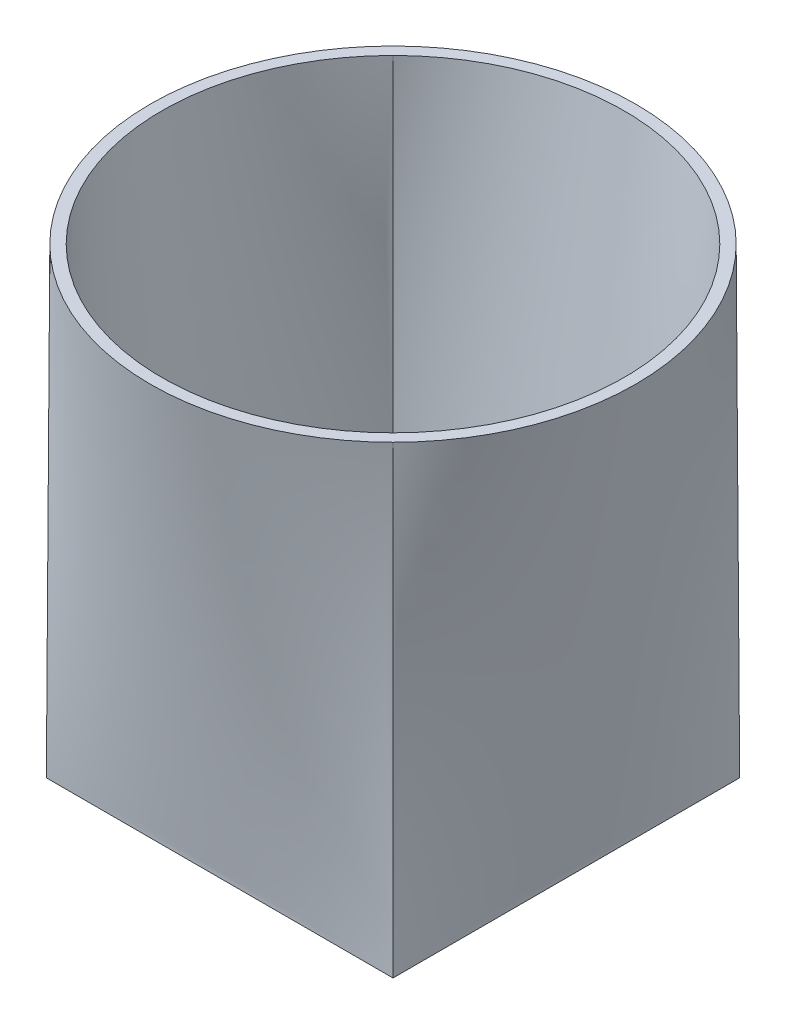
ISO-10303-21;
HEADER;
FILE_DESCRIPTION(('STEP AP214'),'2;1');
FILE_NAME('part.step','',(''),(''),'','','');
FILE_SCHEMA(('AUTOMOTIVE_DESIGN { 1 0 10303 214 1 1 1 1 }'));
ENDSEC;
DATA;
#1=APPLICATION_CONTEXT('core data for automotive mechanical design processes');
#2=APPLICATION_PROTOCOL_DEFINITION('international standard','automotive_design',2000,#1);
#3=PRODUCT_CONTEXT('',#1,'mechanical');
#4=PRODUCT('Part','Part','',(#3));
#5=PRODUCT_RELATED_PRODUCT_CATEGORY('part','',(#4));
#6=PRODUCT_DEFINITION_FORMATION('','',#4);
#7=PRODUCT_DEFINITION_CONTEXT('part definition',#1,'design');
#8=PRODUCT_DEFINITION('design','',#6,#7);
#9=PRODUCT_DEFINITION_SHAPE('','',#8);
#10=(LENGTH_UNIT() NAMED_UNIT(*) SI_UNIT(.MILLI.,.METRE.));
#11=(NAMED_UNIT(*) PLANE_ANGLE_UNIT() SI_UNIT($,.RADIAN.));
#12=(NAMED_UNIT(*) SI_UNIT($,.STERADIAN.) SOLID_ANGLE_UNIT());
#13=UNCERTAINTY_MEASURE_WITH_UNIT(LENGTH_MEASURE(1.E-05),#10,'distance_accuracy_value','');
#14=(GEOMETRIC_REPRESENTATION_CONTEXT(3) GLOBAL_UNCERTAINTY_ASSIGNED_CONTEXT((#13)) GLOBAL_UNIT_ASSIGNED_CONTEXT((#10,
#11,#12)) REPRESENTATION_CONTEXT('',''));
#15=CARTESIAN_POINT('',(0.,0.,0.));
#16=DIRECTION('',(0.,0.,1.));
#17=DIRECTION('',(1.,0.,0.));
#18=AXIS2_PLACEMENT_3D('',#15,#16,#17);
#19=CARTESIAN_POINT('',(0.,0.,0.));
#20=DIRECTION('',(0.,1.,0.));
#21=DIRECTION('',(0.,0.,1.));
#22=AXIS2_PLACEMENT_3D('',#19,#20,#21);
#23=PLANE('',#22);
#24=DIRECTION('',(0.,0.,-1.));
#25=VECTOR('',#24,1.);
#26=CARTESIAN_POINT('',(-72.5,0.,72.5));
#27=LINE('',#26,#25);
#28=CARTESIAN_POINT('',(-72.5,0.,72.5));
#29=VERTEX_POINT('',#28);
#30=CARTESIAN_POINT('',(-72.5,0.,-72.5));
#31=VERTEX_POINT('',#30);
#32=EDGE_CURVE('E106',#29,#31,#27,.T.);
#33=ORIENTED_EDGE('',*,*,#32,.F.);
#34=DIRECTION('',(-1.,0.,0.));
#35=VECTOR('',#34,1.);
#36=CARTESIAN_POINT('',(-72.5,0.,72.5));
#37=LINE('',#36,#35);
#38=CARTESIAN_POINT('',(72.5,0.,72.5));
#39=VERTEX_POINT('',#38);
#40=EDGE_CURVE('E195',#39,#29,#37,.T.);
#41=ORIENTED_EDGE('',*,*,#40,.F.);
#42=DIRECTION('',(0.,0.,1.));
#43=VECTOR('',#42,1.);
#44=CARTESIAN_POINT('',(72.5,0.,72.5));
#45=LINE('',#44,#43);
#46=CARTESIAN_POINT('',(72.5,0.,-72.5));
#47=VERTEX_POINT('',#46);
#48=EDGE_CURVE('E176',#47,#39,#45,.T.);
#49=ORIENTED_EDGE('',*,*,#48,.F.);
#50=DIRECTION('',(1.,0.,0.));
#51=VECTOR('',#50,1.);
#52=CARTESIAN_POINT('',(-72.5,0.,-72.5));
#53=LINE('',#52,#51);
#54=EDGE_CURVE('E168',#31,#47,#53,.T.);
#55=ORIENTED_EDGE('',*,*,#54,.F.);
#56=EDGE_LOOP('',(#33,#41,#49,#55));
#57=FACE_BOUND('',#56,.T.);
#58=DIRECTION('',(0.,0.,-1.));
#59=VECTOR('',#58,1.);
#60=CARTESIAN_POINT('',(75.,0.,-75.));
#61=LINE('',#60,#59);
#62=CARTESIAN_POINT('',(75.,0.,75.));
#63=VERTEX_POINT('',#62);
#64=CARTESIAN_POINT('',(75.,0.,-75.));
#65=VERTEX_POINT('',#64);
#66=EDGE_CURVE('E449',#63,#65,#61,.T.);
#67=ORIENTED_EDGE('',*,*,#66,.F.);
#68=DIRECTION('',(1.,0.,0.));
#69=VECTOR('',#68,1.);
#70=CARTESIAN_POINT('',(-75.,0.,75.));
#71=LINE('',#70,#69);
#72=CARTESIAN_POINT('',(-75.,0.,75.));
#73=VERTEX_POINT('',#72);
#74=EDGE_CURVE('E453',#73,#63,#71,.T.);
#75=ORIENTED_EDGE('',*,*,#74,.F.);
#76=DIRECTION('',(0.,0.,1.));
#77=VECTOR('',#76,1.);
#78=CARTESIAN_POINT('',(-75.,0.,-75.));
#79=LINE('',#78,#77);
#80=CARTESIAN_POINT('',(-75.,0.,-75.));
#81=VERTEX_POINT('',#80);
#82=EDGE_CURVE('E113',#81,#73,#79,.T.);
#83=ORIENTED_EDGE('',*,*,#82,.F.);
#84=DIRECTION('',(-1.,0.,0.));
#85=VECTOR('',#84,1.);
#86=CARTESIAN_POINT('',(-75.,0.,-75.));
#87=LINE('',#86,#85);
#88=EDGE_CURVE('E12',#65,#81,#87,.T.);
#89=ORIENTED_EDGE('',*,*,#88,.F.);
#90=EDGE_LOOP('',(#67,#75,#83,#89));
#91=FACE_BOUND('',#90,.T.);
#92=ADVANCED_FACE('F102',(#57,#91),#23,.F.);
#93=CARTESIAN_POINT('',(0.,200.,0.));
#94=DIRECTION('',(0.,1.,0.));
#95=DIRECTION('',(0.,0.,1.));
#96=AXIS2_PLACEMENT_3D('',#93,#94,#95);
#97=PLANE('',#96);
#98=CARTESIAN_POINT('',(0.,200.,0.));
#99=DIRECTION('',(0.,1.,0.));
#100=DIRECTION('',(0.,0.,1.));
#101=AXIS2_PLACEMENT_3D('',#98,#99,#100);
#102=CIRCLE('',#101,100.);
#103=CARTESIAN_POINT('',(-70.7106781186548,200.,70.7106781186547));
#104=VERTEX_POINT('',#103);
#105=CARTESIAN_POINT('',(70.7106781186547,200.,70.7106781186548));
#106=VERTEX_POINT('',#105);
#107=EDGE_CURVE('E238',#104,#106,#102,.T.);
#108=ORIENTED_EDGE('',*,*,#107,.F.);
#109=CARTESIAN_POINT('',(-70.7106781186547,200.,-70.7106781186548));
#110=VERTEX_POINT('',#109);
#111=EDGE_CURVE('E224',#110,#104,#102,.T.);
#112=ORIENTED_EDGE('',*,*,#111,.F.);
#113=CARTESIAN_POINT('',(70.7106781186548,200.,-70.7106781186548));
#114=VERTEX_POINT('',#113);
#115=EDGE_CURVE('E215',#114,#110,#102,.T.);
#116=ORIENTED_EDGE('',*,*,#115,.F.);
#117=EDGE_CURVE('E187',#106,#114,#102,.T.);
#118=ORIENTED_EDGE('',*,*,#117,.F.);
#119=EDGE_LOOP('',(#108,#112,#116,#118));
#120=FACE_BOUND('',#119,.T.);
#121=CARTESIAN_POINT('',(0.,200.,0.));
#122=DIRECTION('',(0.,1.,0.));
#123=DIRECTION('',(0.,0.,1.));
#124=AXIS2_PLACEMENT_3D('',#121,#122,#123);
#125=CIRCLE('',#124,105.);
#126=CARTESIAN_POINT('',(-74.2462120245875,200.,74.2462120245875));
#127=VERTEX_POINT('',#126);
#128=CARTESIAN_POINT('',(74.2462120245875,200.,74.2462120245874));
#129=VERTEX_POINT('',#128);
#130=EDGE_CURVE('E258',#127,#129,#125,.T.);
#131=ORIENTED_EDGE('',*,*,#130,.T.);
#132=CARTESIAN_POINT('',(74.2462120245875,200.,-74.2462120245875));
#133=VERTEX_POINT('',#132);
#134=EDGE_CURVE('E262',#129,#133,#125,.T.);
#135=ORIENTED_EDGE('',*,*,#134,.T.);
#136=CARTESIAN_POINT('',(-74.2462120245875,200.,-74.2462120245875));
#137=VERTEX_POINT('',#136);
#138=EDGE_CURVE('E266',#133,#137,#125,.T.);
#139=ORIENTED_EDGE('',*,*,#138,.T.);
#140=EDGE_CURVE('E252',#137,#127,#125,.T.);
#141=ORIENTED_EDGE('',*,*,#140,.T.);
#142=EDGE_LOOP('',(#131,#135,#139,#141));
#143=FACE_BOUND('',#142,.T.);
#144=ADVANCED_FACE('F277',(#120,#143),#97,.T.);
#145=CARTESIAN_POINT('',(74.2462120245875,200.,-74.2462120245875));
#146=CARTESIAN_POINT('',(75.,0.,-75.));
#147=CARTESIAN_POINT('',(76.4337120245875,200.,-72.0587120245875));
#148=CARTESIAN_POINT('',(75.,0.,-71.875));
#149=CARTESIAN_POINT('',(78.5646858017279,200.,-69.7341585642478));
#150=CARTESIAN_POINT('',(75.,0.,-68.75));
#151=CARTESIAN_POINT('',(82.6697761168792,200.,-64.8148967643469));
#152=CARTESIAN_POINT('',(75.,0.,-62.5));
#153=CARTESIAN_POINT('',(84.6438301750989,200.,-62.2201532757538));
#154=CARTESIAN_POINT('',(75.,0.,-59.375));
#155=CARTESIAN_POINT('',(88.3897023017118,200.,-56.7731097209239));
#156=CARTESIAN_POINT('',(75.,0.,-53.125));
#157=CARTESIAN_POINT('',(90.1614437971107,200.,-53.9207914276773));
#158=CARTESIAN_POINT('',(75.,0.,-50.));
#159=CARTESIAN_POINT('',(93.4579283018656,200.,-47.9807600324338));
#160=CARTESIAN_POINT('',(75.,0.,-43.75));
#161=CARTESIAN_POINT('',(94.982586042966,200.,-44.8930514793373));
#162=CARTESIAN_POINT('',(75.,0.,-40.625));
#163=CARTESIAN_POINT('',(97.7432083368779,200.,-38.5141914954675));
#164=CARTESIAN_POINT('',(75.,0.,-34.375));
#165=CARTESIAN_POINT('',(98.9790869303233,200.,-35.2230712005603));
#166=CARTESIAN_POINT('',(75.,0.,-31.25));
#167=CARTESIAN_POINT('',(101.126125963506,200.,-28.4786067421382));
#168=CARTESIAN_POINT('',(75.,0.,-25.));
#169=CARTESIAN_POINT('',(102.037209438696,200.,-25.0253208193155));
#170=CARTESIAN_POINT('',(75.,0.,-21.875));
#171=CARTESIAN_POINT('',(103.506785683951,200.,-18.0056688163095));
#172=CARTESIAN_POINT('',(75.,0.,-15.625));
#173=CARTESIAN_POINT('',(104.065220286321,200.,-14.4393845543253));
#174=CARTESIAN_POINT('',(75.,0.,-12.5));
#175=CARTESIAN_POINT('',(104.811843117646,200.,-7.24868552429196));
#176=CARTESIAN_POINT('',(75.,0.,-6.25000000000003));
#177=CARTESIAN_POINT('',(105.,200.,-3.62436867076459));
#178=CARTESIAN_POINT('',(75.,0.,-3.12500000000003));
#179=CARTESIAN_POINT('',(105.,200.,3.62436867076457));
#180=CARTESIAN_POINT('',(75.,0.,3.12499999999998));
#181=CARTESIAN_POINT('',(104.811843117646,200.,7.24868552429194));
#182=CARTESIAN_POINT('',(75.,0.,6.24999999999998));
#183=CARTESIAN_POINT('',(104.065220286321,200.,14.4393845543253));
#184=CARTESIAN_POINT('',(75.,0.,12.5));
#185=CARTESIAN_POINT('',(103.506785683951,200.,18.0056688163094));
#186=CARTESIAN_POINT('',(75.,0.,15.625));
#187=CARTESIAN_POINT('',(102.037209438696,200.,25.0253208193154));
#188=CARTESIAN_POINT('',(75.,0.,21.875));
#189=CARTESIAN_POINT('',(101.126125963506,200.,28.4786067421382));
#190=CARTESIAN_POINT('',(75.,0.,25.));
#191=CARTESIAN_POINT('',(98.9790869303233,200.,35.2230712005603));
#192=CARTESIAN_POINT('',(75.,0.,31.25));
#193=CARTESIAN_POINT('',(97.7432083368779,200.,38.5141914954675));
#194=CARTESIAN_POINT('',(75.,0.,34.375));
#195=CARTESIAN_POINT('',(94.9825860429659,200.,44.8930514793373));
#196=CARTESIAN_POINT('',(75.,0.,40.625));
#197=CARTESIAN_POINT('',(93.4579283018656,200.,47.9807600324338));
#198=CARTESIAN_POINT('',(75.,0.,43.75));
#199=CARTESIAN_POINT('',(90.1614437971107,200.,53.9207914276773));
#200=CARTESIAN_POINT('',(75.,0.,50.));
#201=CARTESIAN_POINT('',(88.3897023017118,200.,56.7731097209239));
#202=CARTESIAN_POINT('',(75.,0.,53.125));
#203=CARTESIAN_POINT('',(84.6438301750989,200.,62.2201532757538));
#204=CARTESIAN_POINT('',(75.,0.,59.375));
#205=CARTESIAN_POINT('',(82.6697761168792,200.,64.8148967643469));
#206=CARTESIAN_POINT('',(75.,0.,62.5));
#207=CARTESIAN_POINT('',(78.5646858017279,200.,69.7341585642477));
#208=CARTESIAN_POINT('',(75.,0.,68.75));
#209=CARTESIAN_POINT('',(76.4337120245875,200.,72.0587120245875));
#210=CARTESIAN_POINT('',(75.,0.,71.875));
#211=CARTESIAN_POINT('',(74.2462120245875,200.,74.2462120245874));
#212=CARTESIAN_POINT('',(75.,0.,75.));
#213=B_SPLINE_SURFACE_WITH_KNOTS('',3,1,((#145,#146),(#147,#148),(#149,#150),(#151,#152),(#153,
#154),(#155,#156),(#157,#158),(#159,#160),(#161,#162),(#163,#164),(#165,#166),(#167,#168),(#169,
#170),(#171,#172),(#173,#174),(#175,#176),(#177,#178),(#179,#180),(#181,#182),(#183,#184),(#185,
#186),(#187,#188),(#189,#190),(#191,#192),(#193,#194),(#195,#196),(#197,#198),(#199,#200),(#201,
#202),(#203,#204),(#205,#206),(#207,#208),(#209,#210),(#211,#212)),.UNSPECIFIED.,.F.,.F.,.F.,(4,
2,2,2,2,2,2,2,2,2,2,2,2,2,2,2,4),(2,2),(0.,0.0624999999999999,0.125,0.1875,0.25,0.3125,0.375,
0.4375,0.5,0.5625,0.625,0.6875,0.75,0.8125,0.875,0.9375,1.),(0.,1.),.UNSPECIFIED.);
#214=DIRECTION('',(0.00376888634075952,-0.999985795394865,0.00376888634076008));
#215=VECTOR('',#214,1.);
#216=CARTESIAN_POINT('',(74.6231060122938,100.,74.6231060122937));
#217=LINE('',#216,#215);
#218=EDGE_CURVE('E438',#129,#63,#217,.T.);
#219=DIRECTION('',(-0.00376888634075966,0.999985795394865,0.00376888634075987));
#220=VECTOR('',#219,1.);
#221=CARTESIAN_POINT('',(74.6231060122937,100.,-74.6231060122937));
#222=LINE('',#221,#220);
#223=EDGE_CURVE('E435',#65,#133,#222,.T.);
#224=ORIENTED_EDGE('',*,*,#134,.F.);
#225=ORIENTED_EDGE('',*,*,#218,.T.);
#226=ORIENTED_EDGE('',*,*,#66,.T.);
#227=ORIENTED_EDGE('',*,*,#223,.T.);
#228=EDGE_LOOP('',(#224,#225,#226,#227));
#229=FACE_BOUND('',#228,.T.);
#230=ADVANCED_FACE('F287',(#229),#213,.T.);
#231=CARTESIAN_POINT('',(74.2462120245875,200.,74.2462120245875));
#232=CARTESIAN_POINT('',(75.,0.,75.));
#233=CARTESIAN_POINT('',(72.0587120245875,200.,76.4337120245875));
#234=CARTESIAN_POINT('',(71.875,0.,75.));
#235=CARTESIAN_POINT('',(69.7341585642478,200.,78.5646858017279));
#236=CARTESIAN_POINT('',(68.75,0.,75.));
#237=CARTESIAN_POINT('',(64.8148967643469,200.,82.6697761168792));
#238=CARTESIAN_POINT('',(62.5,0.,75.));
#239=CARTESIAN_POINT('',(62.2201532757539,200.,84.6438301750989));
#240=CARTESIAN_POINT('',(59.375,0.,75.));
#241=CARTESIAN_POINT('',(56.7731097209239,200.,88.3897023017117));
#242=CARTESIAN_POINT('',(53.125,0.,75.));
#243=CARTESIAN_POINT('',(53.9207914276773,200.,90.1614437971107));
#244=CARTESIAN_POINT('',(50.,0.,75.));
#245=CARTESIAN_POINT('',(47.9807600324338,200.,93.4579283018656));
#246=CARTESIAN_POINT('',(43.75,0.,75.));
#247=CARTESIAN_POINT('',(44.8930514793374,200.,94.982586042966));
#248=CARTESIAN_POINT('',(40.625,0.,75.));
#249=CARTESIAN_POINT('',(38.5141914954675,200.,97.7432083368779));
#250=CARTESIAN_POINT('',(34.375,0.,75.));
#251=CARTESIAN_POINT('',(35.2230712005604,200.,98.9790869303233));
#252=CARTESIAN_POINT('',(31.25,0.,75.));
#253=CARTESIAN_POINT('',(28.4786067421382,200.,101.126125963506));
#254=CARTESIAN_POINT('',(25.,0.,75.));
#255=CARTESIAN_POINT('',(25.0253208193154,200.,102.037209438696));
#256=CARTESIAN_POINT('',(21.875,0.,75.));
#257=CARTESIAN_POINT('',(18.0056688163094,200.,103.506785683951));
#258=CARTESIAN_POINT('',(15.625,0.,75.));
#259=CARTESIAN_POINT('',(14.4393845543253,200.,104.065220286321));
#260=CARTESIAN_POINT('',(12.5,0.,75.));
#261=CARTESIAN_POINT('',(7.24868552429193,200.,104.811843117646));
#262=CARTESIAN_POINT('',(6.25000000000003,0.,75.));
#263=CARTESIAN_POINT('',(3.62436867076457,200.,105.));
#264=CARTESIAN_POINT('',(3.12500000000003,0.,75.));
#265=CARTESIAN_POINT('',(-3.6243686707646,200.,105.));
#266=CARTESIAN_POINT('',(-3.12499999999997,0.,75.));
#267=CARTESIAN_POINT('',(-7.24868552429196,200.,104.811843117646));
#268=CARTESIAN_POINT('',(-6.24999999999996,0.,75.));
#269=CARTESIAN_POINT('',(-14.4393845543253,200.,104.065220286321));
#270=CARTESIAN_POINT('',(-12.5,0.,75.));
#271=CARTESIAN_POINT('',(-18.0056688163095,200.,103.506785683951));
#272=CARTESIAN_POINT('',(-15.625,0.,75.));
#273=CARTESIAN_POINT('',(-25.0253208193155,200.,102.037209438696));
#274=CARTESIAN_POINT('',(-21.875,0.,75.));
#275=CARTESIAN_POINT('',(-28.4786067421383,200.,101.126125963506));
#276=CARTESIAN_POINT('',(-25.,0.,75.));
#277=CARTESIAN_POINT('',(-35.2230712005604,200.,98.9790869303232));
#278=CARTESIAN_POINT('',(-31.25,0.,75.));
#279=CARTESIAN_POINT('',(-38.5141914954676,200.,97.7432083368779));
#280=CARTESIAN_POINT('',(-34.375,0.,75.));
#281=CARTESIAN_POINT('',(-44.8930514793374,200.,94.982586042966));
#282=CARTESIAN_POINT('',(-40.625,0.,75.));
#283=CARTESIAN_POINT('',(-47.9807600324338,200.,93.4579283018655));
#284=CARTESIAN_POINT('',(-43.75,0.,75.));
#285=CARTESIAN_POINT('',(-53.9207914276774,200.,90.1614437971107));
#286=CARTESIAN_POINT('',(-50.,0.,75.));
#287=CARTESIAN_POINT('',(-56.7731097209239,200.,88.3897023017117));
#288=CARTESIAN_POINT('',(-53.125,0.,75.));
#289=CARTESIAN_POINT('',(-62.2201532757539,200.,84.6438301750989));
#290=CARTESIAN_POINT('',(-59.375,0.,75.));
#291=CARTESIAN_POINT('',(-64.8148967643469,200.,82.6697761168792));
#292=CARTESIAN_POINT('',(-62.5,0.,75.));
#293=CARTESIAN_POINT('',(-69.7341585642478,200.,78.5646858017279));
#294=CARTESIAN_POINT('',(-68.75,0.,75.));
#295=CARTESIAN_POINT('',(-72.0587120245875,200.,76.4337120245875));
#296=CARTESIAN_POINT('',(-71.875,0.,75.));
#297=CARTESIAN_POINT('',(-74.2462120245875,200.,74.2462120245875));
#298=CARTESIAN_POINT('',(-75.,0.,75.));
#299=B_SPLINE_SURFACE_WITH_KNOTS('',3,1,((#231,#232),(#233,#234),(#235,#236),(#237,#238),(#239,
#240),(#241,#242),(#243,#244),(#245,#246),(#247,#248),(#249,#250),(#251,#252),(#253,#254),(#255,
#256),(#257,#258),(#259,#260),(#261,#262),(#263,#264),(#265,#266),(#267,#268),(#269,#270),(#271,
#272),(#273,#274),(#275,#276),(#277,#278),(#279,#280),(#281,#282),(#283,#284),(#285,#286),(#287,
#288),(#289,#290),(#291,#292),(#293,#294),(#295,#296),(#297,#298)),.UNSPECIFIED.,.F.,.F.,.F.,(4,
2,2,2,2,2,2,2,2,2,2,2,2,2,2,2,4),(2,2),(0.,0.0625,0.125,0.1875,0.25,0.3125,0.375,0.4375,0.5,
0.5625,0.625,0.6875,0.75,0.8125,0.875,0.9375,1.),(0.,1.),.UNSPECIFIED.);
#300=DIRECTION('',(-0.0037688863407598,-0.999985795394865,0.00376888634075994));
#301=VECTOR('',#300,1.);
#302=CARTESIAN_POINT('',(-74.6231060122938,100.,74.6231060122937));
#303=LINE('',#302,#301);
#304=EDGE_CURVE('E442',#127,#73,#303,.T.);
#305=ORIENTED_EDGE('',*,*,#130,.F.);
#306=ORIENTED_EDGE('',*,*,#304,.T.);
#307=ORIENTED_EDGE('',*,*,#74,.T.);
#308=ORIENTED_EDGE('',*,*,#218,.F.);
#309=EDGE_LOOP('',(#305,#306,#307,#308));
#310=FACE_BOUND('',#309,.T.);
#311=ADVANCED_FACE('F505',(#310),#299,.T.);
#312=CARTESIAN_POINT('',(-74.2462120245875,200.,-74.2462120245875));
#313=CARTESIAN_POINT('',(-75.,0.,-75.));
#314=CARTESIAN_POINT('',(-72.0587120245875,200.,-76.4337120245875));
#315=CARTESIAN_POINT('',(-71.875,0.,-75.));
#316=CARTESIAN_POINT('',(-69.7341585642478,200.,-78.5646858017279));
#317=CARTESIAN_POINT('',(-68.75,0.,-75.));
#318=CARTESIAN_POINT('',(-64.8148967643469,200.,-82.6697761168792));
#319=CARTESIAN_POINT('',(-62.5,0.,-75.));
#320=CARTESIAN_POINT('',(-62.2201532757538,200.,-84.6438301750989));
#321=CARTESIAN_POINT('',(-59.375,0.,-75.));
#322=CARTESIAN_POINT('',(-56.7731097209239,200.,-88.3897023017117));
#323=CARTESIAN_POINT('',(-53.125,0.,-75.));
#324=CARTESIAN_POINT('',(-53.9207914276773,200.,-90.1614437971107));
#325=CARTESIAN_POINT('',(-50.,0.,-75.));
#326=CARTESIAN_POINT('',(-47.9807600324338,200.,-93.4579283018656));
#327=CARTESIAN_POINT('',(-43.75,0.,-75.));
#328=CARTESIAN_POINT('',(-44.8930514793373,200.,-94.982586042966));
#329=CARTESIAN_POINT('',(-40.625,0.,-75.));
#330=CARTESIAN_POINT('',(-38.5141914954675,200.,-97.7432083368779));
#331=CARTESIAN_POINT('',(-34.375,0.,-75.));
#332=CARTESIAN_POINT('',(-35.2230712005603,200.,-98.9790869303233));
#333=CARTESIAN_POINT('',(-31.25,0.,-75.));
#334=CARTESIAN_POINT('',(-28.4786067421382,200.,-101.126125963506));
#335=CARTESIAN_POINT('',(-25.,0.,-75.));
#336=CARTESIAN_POINT('',(-25.0253208193154,200.,-102.037209438696));
#337=CARTESIAN_POINT('',(-21.875,0.,-75.));
#338=CARTESIAN_POINT('',(-18.0056688163094,200.,-103.506785683951));
#339=CARTESIAN_POINT('',(-15.625,0.,-75.));
#340=CARTESIAN_POINT('',(-14.4393845543253,200.,-104.065220286321));
#341=CARTESIAN_POINT('',(-12.5,0.,-75.));
#342=CARTESIAN_POINT('',(-7.24868552429193,200.,-104.811843117646));
#343=CARTESIAN_POINT('',(-6.25000000000002,0.,-75.));
#344=CARTESIAN_POINT('',(-3.62436867076457,200.,-105.));
#345=CARTESIAN_POINT('',(-3.12500000000002,0.,-75.));
#346=CARTESIAN_POINT('',(3.6243686707646,200.,-105.));
#347=CARTESIAN_POINT('',(3.12499999999998,0.,-75.));
#348=CARTESIAN_POINT('',(7.24868552429196,200.,-104.811843117646));
#349=CARTESIAN_POINT('',(6.24999999999998,0.,-75.));
#350=CARTESIAN_POINT('',(14.4393845543253,200.,-104.065220286321));
#351=CARTESIAN_POINT('',(12.5,0.,-75.));
#352=CARTESIAN_POINT('',(18.0056688163095,200.,-103.506785683951));
#353=CARTESIAN_POINT('',(15.625,0.,-75.));
#354=CARTESIAN_POINT('',(25.0253208193155,200.,-102.037209438696));
#355=CARTESIAN_POINT('',(21.875,0.,-75.));
#356=CARTESIAN_POINT('',(28.4786067421382,200.,-101.126125963506));
#357=CARTESIAN_POINT('',(25.,0.,-75.));
#358=CARTESIAN_POINT('',(35.2230712005604,200.,-98.9790869303233));
#359=CARTESIAN_POINT('',(31.25,0.,-75.));
#360=CARTESIAN_POINT('',(38.5141914954675,200.,-97.7432083368779));
#361=CARTESIAN_POINT('',(34.375,0.,-75.));
#362=CARTESIAN_POINT('',(44.8930514793373,200.,-94.982586042966));
#363=CARTESIAN_POINT('',(40.625,0.,-75.));
#364=CARTESIAN_POINT('',(47.9807600324338,200.,-93.4579283018655));
#365=CARTESIAN_POINT('',(43.75,0.,-75.));
#366=CARTESIAN_POINT('',(53.9207914276774,200.,-90.1614437971107));
#367=CARTESIAN_POINT('',(50.,0.,-75.));
#368=CARTESIAN_POINT('',(56.7731097209239,200.,-88.3897023017118));
#369=CARTESIAN_POINT('',(53.125,0.,-75.));
#370=CARTESIAN_POINT('',(62.2201532757539,200.,-84.6438301750989));
#371=CARTESIAN_POINT('',(59.375,0.,-75.));
#372=CARTESIAN_POINT('',(64.8148967643469,200.,-82.6697761168792));
#373=CARTESIAN_POINT('',(62.5,0.,-75.));
#374=CARTESIAN_POINT('',(69.7341585642478,200.,-78.5646858017279));
#375=CARTESIAN_POINT('',(68.75,0.,-75.));
#376=CARTESIAN_POINT('',(72.0587120245875,200.,-76.4337120245875));
#377=CARTESIAN_POINT('',(71.875,0.,-75.));
#378=CARTESIAN_POINT('',(74.2462120245875,200.,-74.2462120245875));
#379=CARTESIAN_POINT('',(75.,0.,-75.));
#380=B_SPLINE_SURFACE_WITH_KNOTS('',3,1,((#312,#313),(#314,#315),(#316,#317),(#318,#319),(#320,
#321),(#322,#323),(#324,#325),(#326,#327),(#328,#329),(#330,#331),(#332,#333),(#334,#335),(#336,
#337),(#338,#339),(#340,#341),(#342,#343),(#344,#345),(#346,#347),(#348,#349),(#350,#351),(#352,
#353),(#354,#355),(#356,#357),(#358,#359),(#360,#361),(#362,#363),(#364,#365),(#366,#367),(#368,
#369),(#370,#371),(#372,#373),(#374,#375),(#376,#377),(#378,#379)),.UNSPECIFIED.,.F.,.F.,.F.,(4,
2,2,2,2,2,2,2,2,2,2,2,2,2,2,2,4),(2,2),(0.,0.0625,0.125,0.1875,0.25,0.3125,0.375,0.4375,0.5,
0.5625,0.625,0.6875,0.75,0.8125,0.875,0.9375,1.),(0.,1.),.UNSPECIFIED.);
#381=DIRECTION('',(-0.00376888634076008,-0.999985795394865,-0.00376888634075973));
#382=VECTOR('',#381,1.);
#383=CARTESIAN_POINT('',(-74.6231060122938,100.,-74.6231060122937));
#384=LINE('',#383,#382);
#385=EDGE_CURVE('E446',#137,#81,#384,.T.);
#386=ORIENTED_EDGE('',*,*,#138,.F.);
#387=ORIENTED_EDGE('',*,*,#223,.F.);
#388=ORIENTED_EDGE('',*,*,#88,.T.);
#389=ORIENTED_EDGE('',*,*,#385,.F.);
#390=EDGE_LOOP('',(#386,#387,#388,#389));
#391=FACE_BOUND('',#390,.T.);
#392=ADVANCED_FACE('F534',(#391),#380,.T.);
#393=CARTESIAN_POINT('',(-74.2462120245875,200.,74.2462120245875));
#394=CARTESIAN_POINT('',(-75.,0.,75.));
#395=CARTESIAN_POINT('',(-76.4337120245875,200.,72.0587120245875));
#396=CARTESIAN_POINT('',(-75.,0.,71.875));
#397=CARTESIAN_POINT('',(-78.5646858017279,200.,69.7341585642478));
#398=CARTESIAN_POINT('',(-75.,0.,68.75));
#399=CARTESIAN_POINT('',(-82.6697761168792,200.,64.8148967643469));
#400=CARTESIAN_POINT('',(-75.,0.,62.5));
#401=CARTESIAN_POINT('',(-84.6438301750989,200.,62.2201532757538));
#402=CARTESIAN_POINT('',(-75.,0.,59.375));
#403=CARTESIAN_POINT('',(-88.3897023017117,200.,56.7731097209238));
#404=CARTESIAN_POINT('',(-75.,0.,53.125));
#405=CARTESIAN_POINT('',(-90.1614437971107,200.,53.9207914276773));
#406=CARTESIAN_POINT('',(-75.,0.,50.));
#407=CARTESIAN_POINT('',(-93.4579283018656,200.,47.9807600324338));
#408=CARTESIAN_POINT('',(-75.,0.,43.75));
#409=CARTESIAN_POINT('',(-94.982586042966,200.,44.8930514793373));
#410=CARTESIAN_POINT('',(-75.,0.,40.625));
#411=CARTESIAN_POINT('',(-97.7432083368779,200.,38.5141914954675));
#412=CARTESIAN_POINT('',(-75.,0.,34.375));
#413=CARTESIAN_POINT('',(-98.9790869303233,200.,35.2230712005603));
#414=CARTESIAN_POINT('',(-75.,0.,31.25));
#415=CARTESIAN_POINT('',(-101.126125963506,200.,28.4786067421382));
#416=CARTESIAN_POINT('',(-75.,0.,25.));
#417=CARTESIAN_POINT('',(-102.037209438696,200.,25.0253208193154));
#418=CARTESIAN_POINT('',(-75.,0.,21.875));
#419=CARTESIAN_POINT('',(-103.506785683951,200.,18.0056688163094));
#420=CARTESIAN_POINT('',(-75.,0.,15.625));
#421=CARTESIAN_POINT('',(-104.065220286321,200.,14.4393845543253));
#422=CARTESIAN_POINT('',(-75.,0.,12.5));
#423=CARTESIAN_POINT('',(-104.811843117646,200.,7.24868552429192));
#424=CARTESIAN_POINT('',(-75.,0.,6.24999999999997));
#425=CARTESIAN_POINT('',(-105.,200.,3.62436867076455));
#426=CARTESIAN_POINT('',(-75.,0.,3.12499999999996));
#427=CARTESIAN_POINT('',(-105.,200.,-3.62436867076461));
#428=CARTESIAN_POINT('',(-75.,0.,-3.12500000000004));
#429=CARTESIAN_POINT('',(-104.811843117646,200.,-7.24868552429198));
#430=CARTESIAN_POINT('',(-75.,0.,-6.25000000000003));
#431=CARTESIAN_POINT('',(-104.065220286321,200.,-14.4393845543253));
#432=CARTESIAN_POINT('',(-75.,0.,-12.5));
#433=CARTESIAN_POINT('',(-103.506785683951,200.,-18.0056688163095));
#434=CARTESIAN_POINT('',(-75.,0.,-15.625));
#435=CARTESIAN_POINT('',(-102.037209438696,200.,-25.0253208193155));
#436=CARTESIAN_POINT('',(-75.,0.,-21.875));
#437=CARTESIAN_POINT('',(-101.126125963506,200.,-28.4786067421383));
#438=CARTESIAN_POINT('',(-75.,0.,-25.));
#439=CARTESIAN_POINT('',(-98.9790869303233,200.,-35.2230712005604));
#440=CARTESIAN_POINT('',(-75.,0.,-31.25));
#441=CARTESIAN_POINT('',(-97.7432083368779,200.,-38.5141914954676));
#442=CARTESIAN_POINT('',(-75.,0.,-34.375));
#443=CARTESIAN_POINT('',(-94.982586042966,200.,-44.8930514793374));
#444=CARTESIAN_POINT('',(-75.,0.,-40.625));
#445=CARTESIAN_POINT('',(-93.4579283018656,200.,-47.9807600324338));
#446=CARTESIAN_POINT('',(-75.,0.,-43.75));
#447=CARTESIAN_POINT('',(-90.1614437971107,200.,-53.9207914276774));
#448=CARTESIAN_POINT('',(-75.,0.,-50.));
#449=CARTESIAN_POINT('',(-88.3897023017118,200.,-56.7731097209239));
#450=CARTESIAN_POINT('',(-75.,0.,-53.125));
#451=CARTESIAN_POINT('',(-84.6438301750989,200.,-62.2201532757539));
#452=CARTESIAN_POINT('',(-75.,0.,-59.375));
#453=CARTESIAN_POINT('',(-82.6697761168792,200.,-64.8148967643469));
#454=CARTESIAN_POINT('',(-75.,0.,-62.5));
#455=CARTESIAN_POINT('',(-78.5646858017279,200.,-69.7341585642478));
#456=CARTESIAN_POINT('',(-75.,0.,-68.75));
#457=CARTESIAN_POINT('',(-76.4337120245875,200.,-72.0587120245875));
#458=CARTESIAN_POINT('',(-75.,0.,-71.875));
#459=CARTESIAN_POINT('',(-74.2462120245875,200.,-74.2462120245875));
#460=CARTESIAN_POINT('',(-75.,0.,-75.));
#461=B_SPLINE_SURFACE_WITH_KNOTS('',3,1,((#393,#394),(#395,#396),(#397,#398),(#399,#400),(#401,
#402),(#403,#404),(#405,#406),(#407,#408),(#409,#410),(#411,#412),(#413,#414),(#415,#416),(#417,
#418),(#419,#420),(#421,#422),(#423,#424),(#425,#426),(#427,#428),(#429,#430),(#431,#432),(#433,
#434),(#435,#436),(#437,#438),(#439,#440),(#441,#442),(#443,#444),(#445,#446),(#447,#448),(#449,
#450),(#451,#452),(#453,#454),(#455,#456),(#457,#458),(#459,#460)),.UNSPECIFIED.,.F.,.F.,.F.,(4,
2,2,2,2,2,2,2,2,2,2,2,2,2,2,2,4),(2,2),(0.,0.0625,0.125,0.1875,0.25,0.3125,0.375,0.4375,0.5,
0.5625,0.625,0.6875,0.75,0.8125,0.875,0.9375,1.),(0.,1.),.UNSPECIFIED.);
#462=ORIENTED_EDGE('',*,*,#140,.F.);
#463=ORIENTED_EDGE('',*,*,#385,.T.);
#464=ORIENTED_EDGE('',*,*,#82,.T.);
#465=ORIENTED_EDGE('',*,*,#304,.F.);
#466=EDGE_LOOP('',(#462,#463,#464,#465));
#467=FACE_BOUND('',#466,.T.);
#468=ADVANCED_FACE('F544',(#467),#461,.T.);
#469=CARTESIAN_POINT('',(-72.5,0.,72.5));
#470=CARTESIAN_POINT('',(-70.7106781186548,200.,70.7106781186547));
#471=CARTESIAN_POINT('',(-69.4791666666667,0.,72.5));
#472=CARTESIAN_POINT('',(-68.6273447853214,200.,72.7940114519881));
#473=CARTESIAN_POINT('',(-66.4583333333334,0.,72.5));
#474=CARTESIAN_POINT('',(-66.4134843469026,200.,74.8235102873599));
#475=CARTESIAN_POINT('',(-60.4166666666668,0.,72.5));
#476=CARTESIAN_POINT('',(-61.7284731089018,200.,78.7331201113135));
#477=CARTESIAN_POINT('',(-57.3958333333334,0.,72.5));
#478=CARTESIAN_POINT('',(-59.2572888340513,200.,80.6131715953323));
#479=CARTESIAN_POINT('',(-51.3541666666668,0.,72.5));
#480=CARTESIAN_POINT('',(-54.0696283056418,200.,84.1806688587731));
#481=CARTESIAN_POINT('',(-48.3333333333335,0.,72.5));
#482=CARTESIAN_POINT('',(-51.3531346930261,200.,85.868041711534));
#483=CARTESIAN_POINT('',(-42.2916666666668,0.,72.5));
#484=CARTESIAN_POINT('',(-45.6959619356512,200.,89.0075507636815));
#485=CARTESIAN_POINT('',(-39.2708333333335,0.,72.5));
#486=CARTESIAN_POINT('',(-42.7552871231784,200.,90.4596057552057));
#487=CARTESIAN_POINT('',(-33.2291666666668,0.,72.5));
#488=CARTESIAN_POINT('',(-36.6801823766358,200.,93.0887698446456));
#489=CARTESIAN_POINT('',(-30.2083333333335,0.,72.5));
#490=CARTESIAN_POINT('',(-33.5457820957718,200.,94.2657970764983));
#491=CARTESIAN_POINT('',(-24.1666666666668,0.,72.5));
#492=CARTESIAN_POINT('',(-27.1224826115602,200.,96.31059615572));
#493=CARTESIAN_POINT('',(-21.1458333333335,0.,72.5));
#494=CARTESIAN_POINT('',(-23.8336388755385,200.,97.17829470352));
#495=CARTESIAN_POINT('',(-15.1041666666669,0.,72.5));
#496=CARTESIAN_POINT('',(-17.1482560155328,200.,98.5778911275724));
#497=CARTESIAN_POINT('',(-12.0833333333335,0.,72.5));
#498=CARTESIAN_POINT('',(-13.7517948136432,200.,99.10973360602));
#499=CARTESIAN_POINT('',(-6.04166666666688,0.,72.5));
#500=CARTESIAN_POINT('',(-6.90351002313519,200.,99.8208029691871));
#501=CARTESIAN_POINT('',(-3.02083333333356,0.,72.5));
#502=CARTESIAN_POINT('',(-3.45177968644247,200.,100.));
#503=CARTESIAN_POINT('',(3.02083333333311,0.,72.5));
#504=CARTESIAN_POINT('',(3.45177968644245,200.,100.));
#505=CARTESIAN_POINT('',(6.04166666666646,0.,72.5));
#506=CARTESIAN_POINT('',(6.90351002313518,200.,99.8208029691871));
#507=CARTESIAN_POINT('',(12.0833333333332,0.,72.5));
#508=CARTESIAN_POINT('',(13.7517948136432,200.,99.10973360602));
#509=CARTESIAN_POINT('',(15.1041666666665,0.,72.5));
#510=CARTESIAN_POINT('',(17.1482560155328,200.,98.5778911275724));
#511=CARTESIAN_POINT('',(21.1458333333332,0.,72.5));
#512=CARTESIAN_POINT('',(23.8336388755385,200.,97.17829470352));
#513=CARTESIAN_POINT('',(24.1666666666665,0.,72.5));
#514=CARTESIAN_POINT('',(27.1224826115602,200.,96.31059615572));
#515=CARTESIAN_POINT('',(30.2083333333332,0.,72.5));
#516=CARTESIAN_POINT('',(33.5457820957718,200.,94.2657970764984));
#517=CARTESIAN_POINT('',(33.2291666666665,0.,72.5));
#518=CARTESIAN_POINT('',(36.6801823766358,200.,93.0887698446456));
#519=CARTESIAN_POINT('',(39.2708333333332,0.,72.5));
#520=CARTESIAN_POINT('',(42.7552871231784,200.,90.4596057552057));
#521=CARTESIAN_POINT('',(42.2916666666666,0.,72.5));
#522=CARTESIAN_POINT('',(45.6959619356513,200.,89.0075507636815));
#523=CARTESIAN_POINT('',(48.3333333333332,0.,72.5));
#524=CARTESIAN_POINT('',(51.353134693026,200.,85.868041711534));
#525=CARTESIAN_POINT('',(51.3541666666666,0.,72.5));
#526=CARTESIAN_POINT('',(54.0696283056418,200.,84.1806688587731));
#527=CARTESIAN_POINT('',(57.3958333333333,0.,72.5));
#528=CARTESIAN_POINT('',(59.2572888340513,200.,80.6131715953323));
#529=CARTESIAN_POINT('',(60.4166666666666,0.,72.5));
#530=CARTESIAN_POINT('',(61.7284731089018,200.,78.7331201113135));
#531=CARTESIAN_POINT('',(66.4583333333333,0.,72.5));
#532=CARTESIAN_POINT('',(66.4134843469027,200.,74.8235102873599));
#533=CARTESIAN_POINT('',(69.4791666666666,0.,72.5));
#534=CARTESIAN_POINT('',(68.6273447853215,200.,72.7940114519881));
#535=CARTESIAN_POINT('',(72.5,0.,72.5));
#536=CARTESIAN_POINT('',(70.7106781186547,200.,70.7106781186548));
#537=B_SPLINE_SURFACE_WITH_KNOTS('',3,1,((#469,#470),(#471,#472),(#473,#474),(#475,#476),(#477,
#478),(#479,#480),(#481,#482),(#483,#484),(#485,#486),(#487,#488),(#489,#490),(#491,#492),(#493,
#494),(#495,#496),(#497,#498),(#499,#500),(#501,#502),(#503,#504),(#505,#506),(#507,#508),(#509,
#510),(#511,#512),(#513,#514),(#515,#516),(#517,#518),(#519,#520),(#521,#522),(#523,#524),(#525,
#526),(#527,#528),(#529,#530),(#531,#532),(#533,#534),(#535,#536)),.UNSPECIFIED.,.F.,.F.,.F.,(4,
2,2,2,2,2,2,2,2,2,2,2,2,2,2,2,4),(2,2),(0.,0.0625,0.125,0.1875,0.25,0.3125,0.375,0.4375,0.5,
0.5625,0.625,0.6875,0.75,0.8125,0.875,0.9375,1.),(0.,1.),.UNSPECIFIED.);
#538=DIRECTION('',(-0.00894589338979352,-0.999919967788881,0.00894589338979352));
#539=VECTOR('',#538,1.);
#540=CARTESIAN_POINT('',(-71.6053390593274,100.,71.6053390593274));
#541=LINE('',#540,#539);
#542=EDGE_CURVE('E351',#104,#29,#541,.T.);
#543=DIRECTION('',(-0.00894589338979338,0.999919967788881,-0.0089458933897931));
#544=VECTOR('',#543,1.);
#545=CARTESIAN_POINT('',(71.6053390593274,100.,71.6053390593274));
#546=LINE('',#545,#544);
#547=EDGE_CURVE('E191',#39,#106,#546,.T.);
#548=ORIENTED_EDGE('',*,*,#40,.T.);
#549=ORIENTED_EDGE('',*,*,#542,.F.);
#550=ORIENTED_EDGE('',*,*,#107,.T.);
#551=ORIENTED_EDGE('',*,*,#547,.F.);
#552=EDGE_LOOP('',(#548,#549,#550,#551));
#553=FACE_BOUND('',#552,.T.);
#554=ADVANCED_FACE('F380',(#553),#537,.F.);
#555=CARTESIAN_POINT('',(72.5,0.,72.5));
#556=CARTESIAN_POINT('',(70.7106781186548,200.,70.7106781186548));
#557=CARTESIAN_POINT('',(72.5,0.,69.4791666666666));
#558=CARTESIAN_POINT('',(72.7940114519881,200.,68.6273447853214));
#559=CARTESIAN_POINT('',(72.5,0.,66.4583333333333));
#560=CARTESIAN_POINT('',(74.8235102873599,200.,66.4134843469026));
#561=CARTESIAN_POINT('',(72.5,0.,60.4166666666666));
#562=CARTESIAN_POINT('',(78.7331201113135,200.,61.7284731089018));
#563=CARTESIAN_POINT('',(72.5,0.,57.3958333333333));
#564=CARTESIAN_POINT('',(80.6131715953323,200.,59.2572888340513));
#565=CARTESIAN_POINT('',(72.5,0.,51.3541666666666));
#566=CARTESIAN_POINT('',(84.1806688587731,200.,54.0696283056418));
#567=CARTESIAN_POINT('',(72.5,0.,48.3333333333333));
#568=CARTESIAN_POINT('',(85.8680417115341,200.,51.353134693026));
#569=CARTESIAN_POINT('',(72.5,0.,42.2916666666666));
#570=CARTESIAN_POINT('',(89.0075507636815,200.,45.6959619356512));
#571=CARTESIAN_POINT('',(72.5,0.,39.2708333333333));
#572=CARTESIAN_POINT('',(90.4596057552057,200.,42.7552871231784));
#573=CARTESIAN_POINT('',(72.5,0.,33.2291666666666));
#574=CARTESIAN_POINT('',(93.0887698446457,200.,36.6801823766357));
#575=CARTESIAN_POINT('',(72.5,0.,30.2083333333333));
#576=CARTESIAN_POINT('',(94.2657970764984,200.,33.5457820957718));
#577=CARTESIAN_POINT('',(72.5,0.,24.1666666666666));
#578=CARTESIAN_POINT('',(96.31059615572,200.,27.1224826115602));
#579=CARTESIAN_POINT('',(72.5,0.,21.1458333333333));
#580=CARTESIAN_POINT('',(97.1782947035201,200.,23.8336388755385));
#581=CARTESIAN_POINT('',(72.5,0.,15.1041666666666));
#582=CARTESIAN_POINT('',(98.5778911275724,200.,17.1482560155328));
#583=CARTESIAN_POINT('',(72.5,0.,12.0833333333333));
#584=CARTESIAN_POINT('',(99.10973360602,200.,13.7517948136432));
#585=CARTESIAN_POINT('',(72.5,0.,6.04166666666664));
#586=CARTESIAN_POINT('',(99.8208029691871,200.,6.90351002313519));
#587=CARTESIAN_POINT('',(72.5,0.,3.02083333333331));
#588=CARTESIAN_POINT('',(100.,200.,3.45177968644246));
#589=CARTESIAN_POINT('',(72.5,0.,-3.02083333333335));
#590=CARTESIAN_POINT('',(100.,200.,-3.45177968644247));
#591=CARTESIAN_POINT('',(72.5,0.,-6.04166666666668));
#592=CARTESIAN_POINT('',(99.8208029691871,200.,-6.90351002313519));
#593=CARTESIAN_POINT('',(72.5,0.,-12.0833333333333));
#594=CARTESIAN_POINT('',(99.10973360602,200.,-13.7517948136432));
#595=CARTESIAN_POINT('',(72.5,0.,-15.1041666666667));
#596=CARTESIAN_POINT('',(98.5778911275724,200.,-17.1482560155328));
#597=CARTESIAN_POINT('',(72.5,0.,-21.1458333333333));
#598=CARTESIAN_POINT('',(97.17829470352,200.,-23.8336388755385));
#599=CARTESIAN_POINT('',(72.5,0.,-24.1666666666667));
#600=CARTESIAN_POINT('',(96.31059615572,200.,-27.1224826115602));
#601=CARTESIAN_POINT('',(72.5,0.,-30.2083333333333));
#602=CARTESIAN_POINT('',(94.2657970764984,200.,-33.5457820957718));
#603=CARTESIAN_POINT('',(72.5,0.,-33.2291666666667));
#604=CARTESIAN_POINT('',(93.0887698446457,200.,-36.6801823766357));
#605=CARTESIAN_POINT('',(72.5,0.,-39.2708333333334));
#606=CARTESIAN_POINT('',(90.4596057552057,200.,-42.7552871231784));
#607=CARTESIAN_POINT('',(72.5,0.,-42.2916666666667));
#608=CARTESIAN_POINT('',(89.0075507636815,200.,-45.6959619356512));
#609=CARTESIAN_POINT('',(72.5,0.,-48.3333333333334));
#610=CARTESIAN_POINT('',(85.8680417115341,200.,-51.353134693026));
#611=CARTESIAN_POINT('',(72.5,0.,-51.3541666666667));
#612=CARTESIAN_POINT('',(84.1806688587731,200.,-54.0696283056418));
#613=CARTESIAN_POINT('',(72.5,0.,-57.3958333333334));
#614=CARTESIAN_POINT('',(80.6131715953323,200.,-59.2572888340513));
#615=CARTESIAN_POINT('',(72.5,0.,-60.4166666666667));
#616=CARTESIAN_POINT('',(78.7331201113135,200.,-61.7284731089018));
#617=CARTESIAN_POINT('',(72.5,0.,-66.4583333333334));
#618=CARTESIAN_POINT('',(74.8235102873599,200.,-66.4134843469026));
#619=CARTESIAN_POINT('',(72.5,0.,-69.4791666666667));
#620=CARTESIAN_POINT('',(72.7940114519881,200.,-68.6273447853214));
#621=CARTESIAN_POINT('',(72.5,0.,-72.5));
#622=CARTESIAN_POINT('',(70.7106781186548,200.,-70.7106781186548));
#623=B_SPLINE_SURFACE_WITH_KNOTS('',3,1,((#555,#556),(#557,#558),(#559,#560),(#561,#562),(#563,
#564),(#565,#566),(#567,#568),(#569,#570),(#571,#572),(#573,#574),(#575,#576),(#577,#578),(#579,
#580),(#581,#582),(#583,#584),(#585,#586),(#587,#588),(#589,#590),(#591,#592),(#593,#594),(#595,
#596),(#597,#598),(#599,#600),(#601,#602),(#603,#604),(#605,#606),(#607,#608),(#609,#610),(#611,
#612),(#613,#614),(#615,#616),(#617,#618),(#619,#620),(#621,#622)),.UNSPECIFIED.,.F.,.F.,.F.,(4,
2,2,2,2,2,2,2,2,2,2,2,2,2,2,2,4),(2,2),(0.,0.0625,0.125,0.1875,0.25,0.3125,0.375,0.4375,0.5,
0.5625,0.625,0.6875,0.75,0.8125,0.875,0.9375,1.),(0.,1.),.UNSPECIFIED.);
#624=DIRECTION('',(-0.00894589338979317,0.999919967788881,0.00894589338979359));
#625=VECTOR('',#624,1.);
#626=CARTESIAN_POINT('',(71.6053390593274,100.,-71.6053390593274));
#627=LINE('',#626,#625);
#628=EDGE_CURVE('E126',#47,#114,#627,.T.);
#629=ORIENTED_EDGE('',*,*,#48,.T.);
#630=ORIENTED_EDGE('',*,*,#547,.T.);
#631=ORIENTED_EDGE('',*,*,#117,.T.);
#632=ORIENTED_EDGE('',*,*,#628,.F.);
#633=EDGE_LOOP('',(#629,#630,#631,#632));
#634=FACE_BOUND('',#633,.T.);
#635=ADVANCED_FACE('F182',(#634),#623,.F.);
#636=CARTESIAN_POINT('',(-72.5,0.,-72.5));
#637=CARTESIAN_POINT('',(-70.7106781186547,200.,-70.7106781186548));
#638=CARTESIAN_POINT('',(-72.5,0.,-69.4791666666667));
#639=CARTESIAN_POINT('',(-72.7940114519881,200.,-68.6273447853214));
#640=CARTESIAN_POINT('',(-72.5,0.,-66.4583333333333));
#641=CARTESIAN_POINT('',(-74.8235102873599,200.,-66.4134843469027));
#642=CARTESIAN_POINT('',(-72.5,0.,-60.4166666666666));
#643=CARTESIAN_POINT('',(-78.7331201113135,200.,-61.7284731089019));
#644=CARTESIAN_POINT('',(-72.5,0.,-57.3958333333333));
#645=CARTESIAN_POINT('',(-80.6131715953323,200.,-59.2572888340513));
#646=CARTESIAN_POINT('',(-72.5,0.,-51.3541666666666));
#647=CARTESIAN_POINT('',(-84.1806688587731,200.,-54.0696283056418));
#648=CARTESIAN_POINT('',(-72.5,0.,-48.3333333333332));
#649=CARTESIAN_POINT('',(-85.868041711534,200.,-51.3531346930261));
#650=CARTESIAN_POINT('',(-72.5,0.,-42.2916666666666));
#651=CARTESIAN_POINT('',(-89.0075507636814,200.,-45.6959619356513));
#652=CARTESIAN_POINT('',(-72.5,0.,-39.2708333333332));
#653=CARTESIAN_POINT('',(-90.4596057552056,200.,-42.7552871231785));
#654=CARTESIAN_POINT('',(-72.5,0.,-33.2291666666665));
#655=CARTESIAN_POINT('',(-93.0887698446456,200.,-36.6801823766358));
#656=CARTESIAN_POINT('',(-72.5,0.,-30.2083333333332));
#657=CARTESIAN_POINT('',(-94.2657970764983,200.,-33.5457820957718));
#658=CARTESIAN_POINT('',(-72.5,0.,-24.1666666666665));
#659=CARTESIAN_POINT('',(-96.31059615572,200.,-27.1224826115603));
#660=CARTESIAN_POINT('',(-72.5,0.,-21.1458333333332));
#661=CARTESIAN_POINT('',(-97.17829470352,200.,-23.8336388755386));
#662=CARTESIAN_POINT('',(-72.5,0.,-15.1041666666665));
#663=CARTESIAN_POINT('',(-98.5778911275724,200.,-17.1482560155329));
#664=CARTESIAN_POINT('',(-72.5,0.,-12.0833333333331));
#665=CARTESIAN_POINT('',(-99.10973360602,200.,-13.7517948136432));
#666=CARTESIAN_POINT('',(-72.5,0.,-6.04166666666647));
#667=CARTESIAN_POINT('',(-99.820802969187,200.,-6.90351002313523));
#668=CARTESIAN_POINT('',(-72.5,0.,-3.02083333333314));
#669=CARTESIAN_POINT('',(-100.,200.,-3.4517796864425));
#670=CARTESIAN_POINT('',(-72.5,0.,3.02083333333353));
#671=CARTESIAN_POINT('',(-100.,200.,3.45177968644242));
#672=CARTESIAN_POINT('',(-72.5,0.,6.04166666666686));
#673=CARTESIAN_POINT('',(-99.820802969187,200.,6.90351002313515));
#674=CARTESIAN_POINT('',(-72.5,0.,12.0833333333335));
#675=CARTESIAN_POINT('',(-99.10973360602,200.,13.7517948136431));
#676=CARTESIAN_POINT('',(-72.5,0.,15.1041666666669));
#677=CARTESIAN_POINT('',(-98.5778911275724,200.,17.1482560155328));
#678=CARTESIAN_POINT('',(-72.5,0.,21.1458333333335));
#679=CARTESIAN_POINT('',(-97.17829470352,200.,23.8336388755385));
#680=CARTESIAN_POINT('',(-72.5,0.,24.1666666666668));
#681=CARTESIAN_POINT('',(-96.31059615572,200.,27.1224826115602));
#682=CARTESIAN_POINT('',(-72.5,0.,30.2083333333335));
#683=CARTESIAN_POINT('',(-94.2657970764984,200.,33.5457820957717));
#684=CARTESIAN_POINT('',(-72.5,0.,33.2291666666668));
#685=CARTESIAN_POINT('',(-93.0887698446456,200.,36.6801823766357));
#686=CARTESIAN_POINT('',(-72.5,0.,39.2708333333335));
#687=CARTESIAN_POINT('',(-90.4596057552057,200.,42.7552871231784));
#688=CARTESIAN_POINT('',(-72.5,0.,42.2916666666668));
#689=CARTESIAN_POINT('',(-89.0075507636815,200.,45.6959619356512));
#690=CARTESIAN_POINT('',(-72.5,0.,48.3333333333335));
#691=CARTESIAN_POINT('',(-85.868041711534,200.,51.353134693026));
#692=CARTESIAN_POINT('',(-72.5,0.,51.3541666666668));
#693=CARTESIAN_POINT('',(-84.1806688587731,200.,54.0696283056418));
#694=CARTESIAN_POINT('',(-72.5,0.,57.3958333333334));
#695=CARTESIAN_POINT('',(-80.6131715953323,200.,59.2572888340513));
#696=CARTESIAN_POINT('',(-72.5,0.,60.4166666666667));
#697=CARTESIAN_POINT('',(-78.7331201113135,200.,61.7284731089018));
#698=CARTESIAN_POINT('',(-72.5,0.,66.4583333333334));
#699=CARTESIAN_POINT('',(-74.8235102873599,200.,66.4134843469026));
#700=CARTESIAN_POINT('',(-72.5,0.,69.4791666666667));
#701=CARTESIAN_POINT('',(-72.7940114519881,200.,68.6273447853214));
#702=CARTESIAN_POINT('',(-72.5,0.,72.5));
#703=CARTESIAN_POINT('',(-70.7106781186548,200.,70.7106781186547));
#704=B_SPLINE_SURFACE_WITH_KNOTS('',3,1,((#636,#637),(#638,#639),(#640,#641),(#642,#643),(#644,
#645),(#646,#647),(#648,#649),(#650,#651),(#652,#653),(#654,#655),(#656,#657),(#658,#659),(#660,
#661),(#662,#663),(#664,#665),(#666,#667),(#668,#669),(#670,#671),(#672,#673),(#674,#675),(#676,
#677),(#678,#679),(#680,#681),(#682,#683),(#684,#685),(#686,#687),(#688,#689),(#690,#691),(#692,
#693),(#694,#695),(#696,#697),(#698,#699),(#700,#701),(#702,#703)),.UNSPECIFIED.,.F.,.F.,.F.,(4,
2,2,2,2,2,2,2,2,2,2,2,2,2,2,2,4),(2,2),(0.,0.0625,0.125,0.1875,0.25,0.3125,0.375,0.4375,0.5,
0.5625,0.625,0.6875,0.75,0.8125,0.875,0.9375,1.),(0.,1.),.UNSPECIFIED.);
#705=DIRECTION('',(0.00894589338979386,0.999919967788881,0.00894589338979317));
#706=VECTOR('',#705,1.);
#707=CARTESIAN_POINT('',(-71.6053390593273,100.,-71.6053390593274));
#708=LINE('',#707,#706);
#709=EDGE_CURVE('E121',#31,#110,#708,.T.);
#710=ORIENTED_EDGE('',*,*,#32,.T.);
#711=ORIENTED_EDGE('',*,*,#709,.T.);
#712=ORIENTED_EDGE('',*,*,#111,.T.);
#713=ORIENTED_EDGE('',*,*,#542,.T.);
#714=EDGE_LOOP('',(#710,#711,#712,#713));
#715=FACE_BOUND('',#714,.T.);
#716=ADVANCED_FACE('F379',(#715),#704,.F.);
#717=CARTESIAN_POINT('',(72.5,0.,-72.5));
#718=CARTESIAN_POINT('',(70.7106781186548,200.,-70.7106781186548));
#719=CARTESIAN_POINT('',(69.4791666666666,0.,-72.5));
#720=CARTESIAN_POINT('',(68.6273447853214,200.,-72.7940114519881));
#721=CARTESIAN_POINT('',(66.4583333333333,0.,-72.5));
#722=CARTESIAN_POINT('',(66.4134843469026,200.,-74.8235102873599));
#723=CARTESIAN_POINT('',(60.4166666666666,0.,-72.5));
#724=CARTESIAN_POINT('',(61.7284731089018,200.,-78.7331201113135));
#725=CARTESIAN_POINT('',(57.3958333333333,0.,-72.5));
#726=CARTESIAN_POINT('',(59.2572888340513,200.,-80.6131715953323));
#727=CARTESIAN_POINT('',(51.3541666666666,0.,-72.5));
#728=CARTESIAN_POINT('',(54.0696283056418,200.,-84.1806688587731));
#729=CARTESIAN_POINT('',(48.3333333333333,0.,-72.5));
#730=CARTESIAN_POINT('',(51.3531346930261,200.,-85.8680417115341));
#731=CARTESIAN_POINT('',(42.2916666666666,0.,-72.5));
#732=CARTESIAN_POINT('',(45.6959619356513,200.,-89.0075507636815));
#733=CARTESIAN_POINT('',(39.2708333333333,0.,-72.5));
#734=CARTESIAN_POINT('',(42.7552871231784,200.,-90.4596057552057));
#735=CARTESIAN_POINT('',(33.2291666666666,0.,-72.5));
#736=CARTESIAN_POINT('',(36.6801823766358,200.,-93.0887698446456));
#737=CARTESIAN_POINT('',(30.2083333333333,0.,-72.5));
#738=CARTESIAN_POINT('',(33.5457820957718,200.,-94.2657970764983));
#739=CARTESIAN_POINT('',(24.1666666666666,0.,-72.5));
#740=CARTESIAN_POINT('',(27.1224826115602,200.,-96.31059615572));
#741=CARTESIAN_POINT('',(21.1458333333333,0.,-72.5));
#742=CARTESIAN_POINT('',(23.8336388755386,200.,-97.17829470352));
#743=CARTESIAN_POINT('',(15.1041666666666,0.,-72.5));
#744=CARTESIAN_POINT('',(17.1482560155328,200.,-98.5778911275723));
#745=CARTESIAN_POINT('',(12.0833333333333,0.,-72.5));
#746=CARTESIAN_POINT('',(13.7517948136432,200.,-99.10973360602));
#747=CARTESIAN_POINT('',(6.04166666666663,0.,-72.5));
#748=CARTESIAN_POINT('',(6.90351002313522,200.,-99.8208029691871));
#749=CARTESIAN_POINT('',(3.02083333333331,0.,-72.5));
#750=CARTESIAN_POINT('',(3.4517796864425,200.,-100.));
#751=CARTESIAN_POINT('',(-3.02083333333336,0.,-72.5));
#752=CARTESIAN_POINT('',(-3.45177968644242,200.,-100.));
#753=CARTESIAN_POINT('',(-6.04166666666671,0.,-72.5));
#754=CARTESIAN_POINT('',(-6.90351002313515,200.,-99.8208029691871));
#755=CARTESIAN_POINT('',(-12.0833333333334,0.,-72.5));
#756=CARTESIAN_POINT('',(-13.7517948136431,200.,-99.10973360602));
#757=CARTESIAN_POINT('',(-15.1041666666667,0.,-72.5));
#758=CARTESIAN_POINT('',(-17.1482560155328,200.,-98.5778911275724));
#759=CARTESIAN_POINT('',(-21.1458333333334,0.,-72.5));
#760=CARTESIAN_POINT('',(-23.8336388755385,200.,-97.1782947035201));
#761=CARTESIAN_POINT('',(-24.1666666666667,0.,-72.5));
#762=CARTESIAN_POINT('',(-27.1224826115602,200.,-96.31059615572));
#763=CARTESIAN_POINT('',(-30.2083333333334,0.,-72.5));
#764=CARTESIAN_POINT('',(-33.5457820957717,200.,-94.2657970764984));
#765=CARTESIAN_POINT('',(-33.2291666666667,0.,-72.5));
#766=CARTESIAN_POINT('',(-36.6801823766357,200.,-93.0887698446456));
#767=CARTESIAN_POINT('',(-39.2708333333334,0.,-72.5));
#768=CARTESIAN_POINT('',(-42.7552871231784,200.,-90.4596057552057));
#769=CARTESIAN_POINT('',(-42.2916666666667,0.,-72.5));
#770=CARTESIAN_POINT('',(-45.6959619356512,200.,-89.0075507636815));
#771=CARTESIAN_POINT('',(-48.3333333333334,0.,-72.5));
#772=CARTESIAN_POINT('',(-51.353134693026,200.,-85.868041711534));
#773=CARTESIAN_POINT('',(-51.3541666666667,0.,-72.5));
#774=CARTESIAN_POINT('',(-54.0696283056418,200.,-84.1806688587731));
#775=CARTESIAN_POINT('',(-57.3958333333334,0.,-72.5));
#776=CARTESIAN_POINT('',(-59.2572888340513,200.,-80.6131715953323));
#777=CARTESIAN_POINT('',(-60.4166666666667,0.,-72.5));
#778=CARTESIAN_POINT('',(-61.7284731089018,200.,-78.7331201113135));
#779=CARTESIAN_POINT('',(-66.4583333333334,0.,-72.5));
#780=CARTESIAN_POINT('',(-66.4134843469026,200.,-74.82351028736));
#781=CARTESIAN_POINT('',(-69.4791666666667,0.,-72.5));
#782=CARTESIAN_POINT('',(-68.6273447853214,200.,-72.7940114519882));
#783=CARTESIAN_POINT('',(-72.5,0.,-72.5));
#784=CARTESIAN_POINT('',(-70.7106781186547,200.,-70.7106781186548));
#785=B_SPLINE_SURFACE_WITH_KNOTS('',3,1,((#717,#718),(#719,#720),(#721,#722),(#723,#724),(#725,
#726),(#727,#728),(#729,#730),(#731,#732),(#733,#734),(#735,#736),(#737,#738),(#739,#740),(#741,
#742),(#743,#744),(#745,#746),(#747,#748),(#749,#750),(#751,#752),(#753,#754),(#755,#756),(#757,
#758),(#759,#760),(#761,#762),(#763,#764),(#765,#766),(#767,#768),(#769,#770),(#771,#772),(#773,
#774),(#775,#776),(#777,#778),(#779,#780),(#781,#782),(#783,#784)),.UNSPECIFIED.,.F.,.F.,.F.,(4,
2,2,2,2,2,2,2,2,2,2,2,2,2,2,2,4),(2,2),(0.,0.0625,0.125,0.1875,0.25,0.3125,0.375,0.4375,0.5,
0.5625,0.625,0.6875,0.75,0.8125,0.875,0.9375,1.),(0.,1.),.UNSPECIFIED.);
#786=ORIENTED_EDGE('',*,*,#54,.T.);
#787=ORIENTED_EDGE('',*,*,#628,.T.);
#788=ORIENTED_EDGE('',*,*,#115,.T.);
#789=ORIENTED_EDGE('',*,*,#709,.F.);
#790=EDGE_LOOP('',(#786,#787,#788,#789));
#791=FACE_BOUND('',#790,.T.);
#792=ADVANCED_FACE('F170',(#791),#785,.F.);
#793=CLOSED_SHELL('',(#92,#144,#230,#311,#392,#468,#554,#635,#716,#792));
#794=MANIFOLD_SOLID_BREP('B2',#793);
#795=ADVANCED_BREP_SHAPE_REPRESENTATION('',(#18,#794),#14);
#796=SHAPE_DEFINITION_REPRESENTATION(#9,#795);
ENDSEC;
END-ISO-10303-21;
